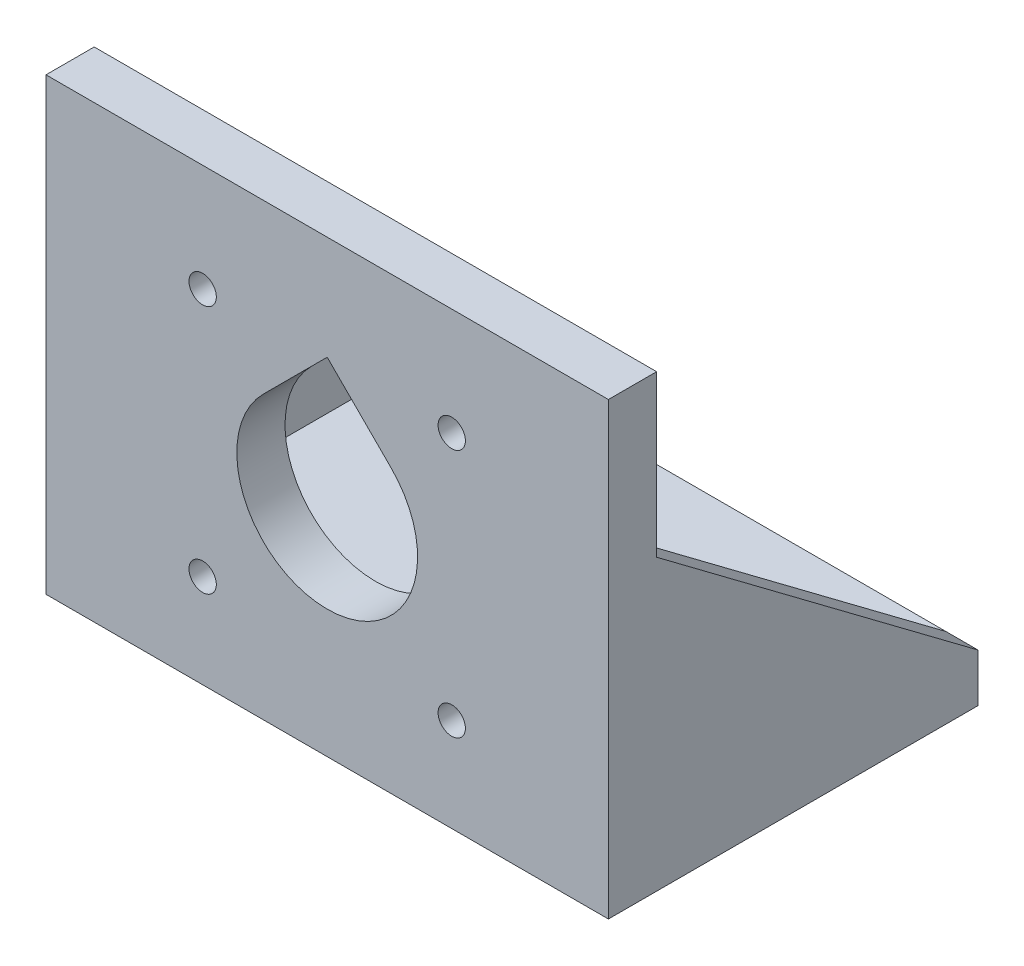
ISO-10303-21;
HEADER;
FILE_DESCRIPTION(('STEP AP214'),'2;1');
FILE_NAME('part.step','',(''),(''),'','','');
FILE_SCHEMA(('AUTOMOTIVE_DESIGN { 1 0 10303 214 1 1 1 1 }'));
ENDSEC;
DATA;
#1=APPLICATION_CONTEXT('core data for automotive mechanical design processes');
#2=APPLICATION_PROTOCOL_DEFINITION('international standard','automotive_design',2000,#1);
#3=PRODUCT_CONTEXT('',#1,'mechanical');
#4=PRODUCT('Part','Part','',(#3));
#5=PRODUCT_RELATED_PRODUCT_CATEGORY('part','',(#4));
#6=PRODUCT_DEFINITION_FORMATION('','',#4);
#7=PRODUCT_DEFINITION_CONTEXT('part definition',#1,'design');
#8=PRODUCT_DEFINITION('design','',#6,#7);
#9=PRODUCT_DEFINITION_SHAPE('','',#8);
#10=(LENGTH_UNIT() NAMED_UNIT(*) SI_UNIT(.MILLI.,.METRE.));
#11=(NAMED_UNIT(*) PLANE_ANGLE_UNIT() SI_UNIT($,.RADIAN.));
#12=(NAMED_UNIT(*) SI_UNIT($,.STERADIAN.) SOLID_ANGLE_UNIT());
#13=UNCERTAINTY_MEASURE_WITH_UNIT(LENGTH_MEASURE(1.E-05),#10,'distance_accuracy_value','');
#14=(GEOMETRIC_REPRESENTATION_CONTEXT(3) GLOBAL_UNCERTAINTY_ASSIGNED_CONTEXT((#13)) GLOBAL_UNIT_ASSIGNED_CONTEXT((#10,
#11,#12)) REPRESENTATION_CONTEXT('',''));
#15=CARTESIAN_POINT('',(0.,0.,0.));
#16=DIRECTION('',(0.,0.,1.));
#17=DIRECTION('',(1.,0.,0.));
#18=AXIS2_PLACEMENT_3D('',#15,#16,#17);
#19=CARTESIAN_POINT('',(0.,0.,0.));
#20=DIRECTION('',(0.,0.,-1.));
#21=DIRECTION('',(-1.,0.,0.));
#22=AXIS2_PLACEMENT_3D('',#19,#20,#21);
#23=PLANE('',#22);
#24=DIRECTION('',(0.707106781186548,0.707106781186548,0.));
#25=VECTOR('',#24,1.);
#26=CARTESIAN_POINT('',(-4.02995128834866,4.02995128834866,0.));
#27=LINE('',#26,#25);
#28=CARTESIAN_POINT('',(27.0450487116513,35.1049512883487,0.));
#29=VERTEX_POINT('',#28);
#30=CARTESIAN_POINT('',(35.,43.0599025766973,0.));
#31=VERTEX_POINT('',#30);
#32=EDGE_CURVE('E268',#29,#31,#27,.T.);
#33=ORIENTED_EDGE('',*,*,#32,.F.);
#34=CARTESIAN_POINT('',(35.,27.15,0.));
#35=DIRECTION('',(0.,0.,-1.));
#36=DIRECTION('',(-1.,0.,0.));
#37=AXIS2_PLACEMENT_3D('',#34,#35,#36);
#38=CIRCLE('',#37,11.25);
#39=CARTESIAN_POINT('',(42.9549512883487,35.1049512883487,0.));
#40=VERTEX_POINT('',#39);
#41=EDGE_CURVE('E149',#40,#29,#38,.T.);
#42=ORIENTED_EDGE('',*,*,#41,.F.);
#43=DIRECTION('',(0.707106781186548,-0.707106781186548,0.));
#44=VECTOR('',#43,1.);
#45=CARTESIAN_POINT('',(39.0299512883487,39.0299512883487,0.));
#46=LINE('',#45,#44);
#47=EDGE_CURVE('E136',#31,#40,#46,.T.);
#48=ORIENTED_EDGE('',*,*,#47,.F.);
#49=EDGE_LOOP('',(#33,#42,#48));
#50=FACE_BOUND('',#49,.T.);
#51=CARTESIAN_POINT('',(50.5,42.65,0.));
#52=DIRECTION('',(0.,0.,-1.));
#53=DIRECTION('',(-1.,0.,0.));
#54=AXIS2_PLACEMENT_3D('',#51,#52,#53);
#55=CIRCLE('',#54,1.7);
#56=CARTESIAN_POINT('',(48.8,42.65,0.));
#57=VERTEX_POINT('',#56);
#58=EDGE_CURVE('E169',#57,#57,#55,.T.);
#59=ORIENTED_EDGE('',*,*,#58,.F.);
#60=EDGE_LOOP('',(#59));
#61=FACE_BOUND('',#60,.T.);
#62=CARTESIAN_POINT('',(50.5,11.65,0.));
#63=DIRECTION('',(0.,0.,-1.));
#64=DIRECTION('',(-1.,0.,0.));
#65=AXIS2_PLACEMENT_3D('',#62,#63,#64);
#66=CIRCLE('',#65,1.7);
#67=CARTESIAN_POINT('',(48.8,11.65,0.));
#68=VERTEX_POINT('',#67);
#69=EDGE_CURVE('E166',#68,#68,#66,.T.);
#70=ORIENTED_EDGE('',*,*,#69,.F.);
#71=EDGE_LOOP('',(#70));
#72=FACE_BOUND('',#71,.T.);
#73=CARTESIAN_POINT('',(19.5,42.65,0.));
#74=DIRECTION('',(0.,0.,-1.));
#75=DIRECTION('',(-1.,0.,0.));
#76=AXIS2_PLACEMENT_3D('',#73,#74,#75);
#77=CIRCLE('',#76,1.7);
#78=CARTESIAN_POINT('',(17.8,42.65,0.));
#79=VERTEX_POINT('',#78);
#80=EDGE_CURVE('E163',#79,#79,#77,.T.);
#81=ORIENTED_EDGE('',*,*,#80,.F.);
#82=EDGE_LOOP('',(#81));
#83=FACE_BOUND('',#82,.T.);
#84=CARTESIAN_POINT('',(19.5,11.65,0.));
#85=DIRECTION('',(0.,0.,-1.));
#86=DIRECTION('',(-1.,0.,0.));
#87=AXIS2_PLACEMENT_3D('',#84,#85,#86);
#88=CIRCLE('',#87,1.7);
#89=CARTESIAN_POINT('',(17.8,11.65,0.));
#90=VERTEX_POINT('',#89);
#91=EDGE_CURVE('E152',#90,#90,#88,.T.);
#92=ORIENTED_EDGE('',*,*,#91,.F.);
#93=EDGE_LOOP('',(#92));
#94=FACE_BOUND('',#93,.T.);
#95=DIRECTION('',(0.,1.,0.));
#96=VECTOR('',#95,1.);
#97=CARTESIAN_POINT('',(70.,0.,0.));
#98=LINE('',#97,#96);
#99=CARTESIAN_POINT('',(70.,36.,0.));
#100=VERTEX_POINT('',#99);
#101=CARTESIAN_POINT('',(70.,56.,0.));
#102=VERTEX_POINT('',#101);
#103=EDGE_CURVE('E226',#100,#102,#98,.T.);
#104=ORIENTED_EDGE('',*,*,#103,.F.);
#105=DIRECTION('',(-1.,0.,0.));
#106=VECTOR('',#105,1.);
#107=CARTESIAN_POINT('',(70.,36.,0.));
#108=LINE('',#107,#106);
#109=CARTESIAN_POINT('',(66.,36.,0.));
#110=VERTEX_POINT('',#109);
#111=EDGE_CURVE('E174',#100,#110,#108,.T.);
#112=ORIENTED_EDGE('',*,*,#111,.T.);
#113=DIRECTION('',(0.,-1.,0.));
#114=VECTOR('',#113,1.);
#115=CARTESIAN_POINT('',(66.,5.99999999999999,0.));
#116=LINE('',#115,#114);
#117=CARTESIAN_POINT('',(66.,5.99999999999999,0.));
#118=VERTEX_POINT('',#117);
#119=EDGE_CURVE('E177',#110,#118,#116,.T.);
#120=ORIENTED_EDGE('',*,*,#119,.T.);
#121=DIRECTION('',(1.,0.,0.));
#122=VECTOR('',#121,1.);
#123=CARTESIAN_POINT('',(0.,6.,0.));
#124=LINE('',#123,#122);
#125=CARTESIAN_POINT('',(4.,6.,0.));
#126=VERTEX_POINT('',#125);
#127=EDGE_CURVE('E238',#126,#118,#124,.T.);
#128=ORIENTED_EDGE('',*,*,#127,.F.);
#129=DIRECTION('',(0.,-1.,0.));
#130=VECTOR('',#129,1.);
#131=CARTESIAN_POINT('',(4.,5.99999999999999,0.));
#132=LINE('',#131,#130);
#133=CARTESIAN_POINT('',(4.,36.,0.));
#134=VERTEX_POINT('',#133);
#135=EDGE_CURVE('E188',#134,#126,#132,.T.);
#136=ORIENTED_EDGE('',*,*,#135,.F.);
#137=DIRECTION('',(-1.,0.,0.));
#138=VECTOR('',#137,1.);
#139=CARTESIAN_POINT('',(4.,36.,0.));
#140=LINE('',#139,#138);
#141=CARTESIAN_POINT('',(0.,36.,0.));
#142=VERTEX_POINT('',#141);
#143=EDGE_CURVE('E199',#134,#142,#140,.T.);
#144=ORIENTED_EDGE('',*,*,#143,.T.);
#145=DIRECTION('',(0.,-1.,0.));
#146=VECTOR('',#145,1.);
#147=CARTESIAN_POINT('',(0.,0.,0.));
#148=LINE('',#147,#146);
#149=CARTESIAN_POINT('',(0.,56.,0.));
#150=VERTEX_POINT('',#149);
#151=EDGE_CURVE('E213',#150,#142,#148,.T.);
#152=ORIENTED_EDGE('',*,*,#151,.F.);
#153=DIRECTION('',(-1.,0.,0.));
#154=VECTOR('',#153,1.);
#155=CARTESIAN_POINT('',(0.,56.,0.));
#156=LINE('',#155,#154);
#157=EDGE_CURVE('E217',#102,#150,#156,.T.);
#158=ORIENTED_EDGE('',*,*,#157,.F.);
#159=EDGE_LOOP('',(#104,#112,#120,#128,#136,#144,#152,#158));
#160=FACE_BOUND('',#159,.T.);
#161=ADVANCED_FACE('F41',(#50,#61,#72,#83,#94,#160),#23,.T.);
#162=CARTESIAN_POINT('',(0.,6.,0.));
#163=DIRECTION('',(0.,1.,0.));
#164=DIRECTION('',(0.,0.,1.));
#165=AXIS2_PLACEMENT_3D('',#162,#163,#164);
#166=PLANE('',#165);
#167=CARTESIAN_POINT('',(8.5,6.,-30.));
#168=DIRECTION('',(0.,1.,0.));
#169=DIRECTION('',(0.,0.,1.));
#170=AXIS2_PLACEMENT_3D('',#167,#168,#169);
#171=CIRCLE('',#170,2.25);
#172=CARTESIAN_POINT('',(8.5,6.,-27.75));
#173=VERTEX_POINT('',#172);
#174=EDGE_CURVE('E262',#173,#173,#171,.T.);
#175=ORIENTED_EDGE('',*,*,#174,.F.);
#176=EDGE_LOOP('',(#175));
#177=FACE_BOUND('',#176,.T.);
#178=CARTESIAN_POINT('',(61.5,6.,-12.));
#179=DIRECTION('',(0.,1.,0.));
#180=DIRECTION('',(0.,0.,1.));
#181=AXIS2_PLACEMENT_3D('',#178,#179,#180);
#182=CIRCLE('',#181,2.25);
#183=CARTESIAN_POINT('',(61.5,6.,-9.75000000000001));
#184=VERTEX_POINT('',#183);
#185=EDGE_CURVE('E251',#184,#184,#182,.T.);
#186=ORIENTED_EDGE('',*,*,#185,.F.);
#187=EDGE_LOOP('',(#186));
#188=FACE_BOUND('',#187,.T.);
#189=CARTESIAN_POINT('',(61.5,6.,-30.));
#190=DIRECTION('',(0.,1.,0.));
#191=DIRECTION('',(0.,0.,1.));
#192=AXIS2_PLACEMENT_3D('',#189,#190,#191);
#193=CIRCLE('',#192,2.25);
#194=CARTESIAN_POINT('',(61.5,6.,-27.75));
#195=VERTEX_POINT('',#194);
#196=EDGE_CURVE('E248',#195,#195,#193,.T.);
#197=ORIENTED_EDGE('',*,*,#196,.F.);
#198=EDGE_LOOP('',(#197));
#199=FACE_BOUND('',#198,.T.);
#200=CARTESIAN_POINT('',(8.5,6.,-12.));
#201=DIRECTION('',(0.,1.,0.));
#202=DIRECTION('',(0.,0.,1.));
#203=AXIS2_PLACEMENT_3D('',#200,#201,#202);
#204=CIRCLE('',#203,2.25);
#205=CARTESIAN_POINT('',(8.5,6.,-9.75));
#206=VERTEX_POINT('',#205);
#207=EDGE_CURVE('E245',#206,#206,#204,.T.);
#208=ORIENTED_EDGE('',*,*,#207,.F.);
#209=EDGE_LOOP('',(#208));
#210=FACE_BOUND('',#209,.T.);
#211=ORIENTED_EDGE('',*,*,#127,.T.);
#212=DIRECTION('',(0.,0.,-1.));
#213=VECTOR('',#212,1.);
#214=CARTESIAN_POINT('',(66.,6.,-40.));
#215=LINE('',#214,#213);
#216=CARTESIAN_POINT('',(66.,6.,-40.));
#217=VERTEX_POINT('',#216);
#218=EDGE_CURVE('E175',#118,#217,#215,.T.);
#219=ORIENTED_EDGE('',*,*,#218,.T.);
#220=DIRECTION('',(-1.,0.,0.));
#221=VECTOR('',#220,1.);
#222=CARTESIAN_POINT('',(0.,6.,-40.));
#223=LINE('',#222,#221);
#224=CARTESIAN_POINT('',(4.,6.,-40.));
#225=VERTEX_POINT('',#224);
#226=EDGE_CURVE('E205',#217,#225,#223,.T.);
#227=ORIENTED_EDGE('',*,*,#226,.T.);
#228=DIRECTION('',(0.,0.,-1.));
#229=VECTOR('',#228,1.);
#230=CARTESIAN_POINT('',(4.,6.,-40.));
#231=LINE('',#230,#229);
#232=EDGE_CURVE('E191',#126,#225,#231,.T.);
#233=ORIENTED_EDGE('',*,*,#232,.F.);
#234=EDGE_LOOP('',(#211,#219,#227,#233));
#235=FACE_BOUND('',#234,.T.);
#236=ADVANCED_FACE('F307',(#177,#188,#199,#210,#235),#166,.T.);
#237=CARTESIAN_POINT('',(0.,0.,6.));
#238=DIRECTION('',(1.,0.,0.));
#239=DIRECTION('',(0.,0.,-1.));
#240=AXIS2_PLACEMENT_3D('',#237,#238,#239);
#241=PLANE('',#240);
#242=ORIENTED_EDGE('',*,*,#151,.T.);
#243=DIRECTION('',(0.,0.6,0.8));
#244=VECTOR('',#243,1.);
#245=CARTESIAN_POINT('',(0.,36.,0.));
#246=LINE('',#245,#244);
#247=CARTESIAN_POINT('',(0.,6.,-40.));
#248=VERTEX_POINT('',#247);
#249=EDGE_CURVE('E184',#248,#142,#246,.T.);
#250=ORIENTED_EDGE('',*,*,#249,.F.);
#251=DIRECTION('',(0.,-1.,0.));
#252=VECTOR('',#251,1.);
#253=CARTESIAN_POINT('',(0.,6.,-40.));
#254=LINE('',#253,#252);
#255=CARTESIAN_POINT('',(0.,0.,-40.));
#256=VERTEX_POINT('',#255);
#257=EDGE_CURVE('E204',#248,#256,#254,.T.);
#258=ORIENTED_EDGE('',*,*,#257,.T.);
#259=DIRECTION('',(0.,0.,-1.));
#260=VECTOR('',#259,1.);
#261=CARTESIAN_POINT('',(0.,0.,6.));
#262=LINE('',#261,#260);
#263=CARTESIAN_POINT('',(0.,0.,6.));
#264=VERTEX_POINT('',#263);
#265=EDGE_CURVE('E236',#264,#256,#262,.T.);
#266=ORIENTED_EDGE('',*,*,#265,.F.);
#267=DIRECTION('',(0.,-1.,0.));
#268=VECTOR('',#267,1.);
#269=CARTESIAN_POINT('',(0.,0.,6.));
#270=LINE('',#269,#268);
#271=CARTESIAN_POINT('',(0.,56.,6.));
#272=VERTEX_POINT('',#271);
#273=EDGE_CURVE('E214',#272,#264,#270,.T.);
#274=ORIENTED_EDGE('',*,*,#273,.F.);
#275=DIRECTION('',(0.,0.,-1.));
#276=VECTOR('',#275,1.);
#277=CARTESIAN_POINT('',(0.,56.,6.));
#278=LINE('',#277,#276);
#279=EDGE_CURVE('E223',#272,#150,#278,.T.);
#280=ORIENTED_EDGE('',*,*,#279,.T.);
#281=EDGE_LOOP('',(#242,#250,#258,#266,#274,#280));
#282=FACE_BOUND('',#281,.T.);
#283=ADVANCED_FACE('F43',(#282),#241,.F.);
#284=CARTESIAN_POINT('',(0.,0.,6.));
#285=DIRECTION('',(0.,1.,0.));
#286=DIRECTION('',(0.,0.,1.));
#287=AXIS2_PLACEMENT_3D('',#284,#285,#286);
#288=PLANE('',#287);
#289=CARTESIAN_POINT('',(8.5,0.,-30.));
#290=DIRECTION('',(0.,1.,0.));
#291=DIRECTION('',(0.,0.,1.));
#292=AXIS2_PLACEMENT_3D('',#289,#290,#291);
#293=CIRCLE('',#292,2.25);
#294=CARTESIAN_POINT('',(8.5,0.,-27.75));
#295=VERTEX_POINT('',#294);
#296=EDGE_CURVE('E45',#295,#295,#293,.T.);
#297=ORIENTED_EDGE('',*,*,#296,.T.);
#298=EDGE_LOOP('',(#297));
#299=FACE_BOUND('',#298,.T.);
#300=CARTESIAN_POINT('',(61.5,0.,-12.));
#301=DIRECTION('',(0.,1.,0.));
#302=DIRECTION('',(0.,0.,1.));
#303=AXIS2_PLACEMENT_3D('',#300,#301,#302);
#304=CIRCLE('',#303,2.25);
#305=CARTESIAN_POINT('',(61.5,0.,-9.75000000000001));
#306=VERTEX_POINT('',#305);
#307=EDGE_CURVE('E249',#306,#306,#304,.T.);
#308=ORIENTED_EDGE('',*,*,#307,.T.);
#309=EDGE_LOOP('',(#308));
#310=FACE_BOUND('',#309,.T.);
#311=CARTESIAN_POINT('',(61.5,0.,-30.));
#312=DIRECTION('',(0.,1.,0.));
#313=DIRECTION('',(0.,0.,1.));
#314=AXIS2_PLACEMENT_3D('',#311,#312,#313);
#315=CIRCLE('',#314,2.25);
#316=CARTESIAN_POINT('',(61.5,0.,-27.75));
#317=VERTEX_POINT('',#316);
#318=EDGE_CURVE('E246',#317,#317,#315,.T.);
#319=ORIENTED_EDGE('',*,*,#318,.T.);
#320=EDGE_LOOP('',(#319));
#321=FACE_BOUND('',#320,.T.);
#322=CARTESIAN_POINT('',(8.5,0.,-12.));
#323=DIRECTION('',(0.,1.,0.));
#324=DIRECTION('',(0.,0.,1.));
#325=AXIS2_PLACEMENT_3D('',#322,#323,#324);
#326=CIRCLE('',#325,2.25);
#327=CARTESIAN_POINT('',(8.5,0.,-9.75));
#328=VERTEX_POINT('',#327);
#329=EDGE_CURVE('E242',#328,#328,#326,.T.);
#330=ORIENTED_EDGE('',*,*,#329,.T.);
#331=EDGE_LOOP('',(#330));
#332=FACE_BOUND('',#331,.T.);
#333=ORIENTED_EDGE('',*,*,#265,.T.);
#334=DIRECTION('',(-1.,0.,0.));
#335=VECTOR('',#334,1.);
#336=CARTESIAN_POINT('',(0.,0.,-40.));
#337=LINE('',#336,#335);
#338=CARTESIAN_POINT('',(70.,0.,-40.));
#339=VERTEX_POINT('',#338);
#340=EDGE_CURVE('E201',#339,#256,#337,.T.);
#341=ORIENTED_EDGE('',*,*,#340,.F.);
#342=DIRECTION('',(0.,0.,-1.));
#343=VECTOR('',#342,1.);
#344=CARTESIAN_POINT('',(70.,0.,6.));
#345=LINE('',#344,#343);
#346=CARTESIAN_POINT('',(70.,0.,6.));
#347=VERTEX_POINT('',#346);
#348=EDGE_CURVE('E234',#347,#339,#345,.T.);
#349=ORIENTED_EDGE('',*,*,#348,.F.);
#350=DIRECTION('',(1.,0.,0.));
#351=VECTOR('',#350,1.);
#352=CARTESIAN_POINT('',(0.,0.,6.));
#353=LINE('',#352,#351);
#354=EDGE_CURVE('E216',#264,#347,#353,.T.);
#355=ORIENTED_EDGE('',*,*,#354,.F.);
#356=EDGE_LOOP('',(#333,#341,#349,#355));
#357=FACE_BOUND('',#356,.T.);
#358=ADVANCED_FACE('F325',(#299,#310,#321,#332,#357),#288,.F.);
#359=CARTESIAN_POINT('',(70.,0.,6.));
#360=DIRECTION('',(-1.,0.,0.));
#361=DIRECTION('',(0.,0.,1.));
#362=AXIS2_PLACEMENT_3D('',#359,#360,#361);
#363=PLANE('',#362);
#364=DIRECTION('',(0.,0.6,0.8));
#365=VECTOR('',#364,1.);
#366=CARTESIAN_POINT('',(70.,36.,0.));
#367=LINE('',#366,#365);
#368=CARTESIAN_POINT('',(70.,6.,-40.));
#369=VERTEX_POINT('',#368);
#370=EDGE_CURVE('E172',#369,#100,#367,.T.);
#371=ORIENTED_EDGE('',*,*,#370,.T.);
#372=ORIENTED_EDGE('',*,*,#103,.T.);
#373=DIRECTION('',(0.,0.,-1.));
#374=VECTOR('',#373,1.);
#375=CARTESIAN_POINT('',(70.,56.,6.));
#376=LINE('',#375,#374);
#377=CARTESIAN_POINT('',(70.,56.,6.));
#378=VERTEX_POINT('',#377);
#379=EDGE_CURVE('E231',#378,#102,#376,.T.);
#380=ORIENTED_EDGE('',*,*,#379,.F.);
#381=DIRECTION('',(0.,1.,0.));
#382=VECTOR('',#381,1.);
#383=CARTESIAN_POINT('',(70.,0.,6.));
#384=LINE('',#383,#382);
#385=EDGE_CURVE('E219',#347,#378,#384,.T.);
#386=ORIENTED_EDGE('',*,*,#385,.F.);
#387=ORIENTED_EDGE('',*,*,#348,.T.);
#388=DIRECTION('',(0.,-1.,0.));
#389=VECTOR('',#388,1.);
#390=CARTESIAN_POINT('',(70.,6.,-40.));
#391=LINE('',#390,#389);
#392=EDGE_CURVE('E210',#369,#339,#391,.T.);
#393=ORIENTED_EDGE('',*,*,#392,.F.);
#394=EDGE_LOOP('',(#371,#372,#380,#386,#387,#393));
#395=FACE_BOUND('',#394,.T.);
#396=ADVANCED_FACE('F322',(#395),#363,.F.);
#397=CARTESIAN_POINT('',(0.,56.,6.));
#398=DIRECTION('',(0.,-1.,0.));
#399=DIRECTION('',(0.,0.,-1.));
#400=AXIS2_PLACEMENT_3D('',#397,#398,#399);
#401=PLANE('',#400);
#402=ORIENTED_EDGE('',*,*,#157,.T.);
#403=ORIENTED_EDGE('',*,*,#279,.F.);
#404=DIRECTION('',(-1.,0.,0.));
#405=VECTOR('',#404,1.);
#406=CARTESIAN_POINT('',(0.,56.,6.));
#407=LINE('',#406,#405);
#408=EDGE_CURVE('E221',#378,#272,#407,.T.);
#409=ORIENTED_EDGE('',*,*,#408,.F.);
#410=ORIENTED_EDGE('',*,*,#379,.T.);
#411=EDGE_LOOP('',(#402,#403,#409,#410));
#412=FACE_BOUND('',#411,.T.);
#413=ADVANCED_FACE('F283',(#412),#401,.F.);
#414=CARTESIAN_POINT('',(0.,0.,6.));
#415=DIRECTION('',(0.,0.,-1.));
#416=DIRECTION('',(-1.,0.,0.));
#417=AXIS2_PLACEMENT_3D('',#414,#415,#416);
#418=PLANE('',#417);
#419=CARTESIAN_POINT('',(50.5,42.65,6.));
#420=DIRECTION('',(0.,0.,1.));
#421=DIRECTION('',(1.,0.,0.));
#422=AXIS2_PLACEMENT_3D('',#419,#420,#421);
#423=CIRCLE('',#422,1.7);
#424=CARTESIAN_POINT('',(52.2,42.65,6.));
#425=VERTEX_POINT('',#424);
#426=EDGE_CURVE('E158',#425,#425,#423,.T.);
#427=ORIENTED_EDGE('',*,*,#426,.F.);
#428=EDGE_LOOP('',(#427));
#429=FACE_BOUND('',#428,.T.);
#430=CARTESIAN_POINT('',(50.5,11.65,6.));
#431=DIRECTION('',(0.,0.,1.));
#432=DIRECTION('',(1.,0.,0.));
#433=AXIS2_PLACEMENT_3D('',#430,#431,#432);
#434=CIRCLE('',#433,1.7);
#435=CARTESIAN_POINT('',(52.2,11.65,6.));
#436=VERTEX_POINT('',#435);
#437=EDGE_CURVE('E271',#436,#436,#434,.T.);
#438=ORIENTED_EDGE('',*,*,#437,.F.);
#439=EDGE_LOOP('',(#438));
#440=FACE_BOUND('',#439,.T.);
#441=CARTESIAN_POINT('',(19.5,42.65,6.));
#442=DIRECTION('',(0.,0.,1.));
#443=DIRECTION('',(1.,0.,0.));
#444=AXIS2_PLACEMENT_3D('',#441,#442,#443);
#445=CIRCLE('',#444,1.7);
#446=CARTESIAN_POINT('',(21.2,42.65,6.));
#447=VERTEX_POINT('',#446);
#448=EDGE_CURVE('E155',#447,#447,#445,.T.);
#449=ORIENTED_EDGE('',*,*,#448,.F.);
#450=EDGE_LOOP('',(#449));
#451=FACE_BOUND('',#450,.T.);
#452=CARTESIAN_POINT('',(19.5,11.65,6.));
#453=DIRECTION('',(0.,0.,1.));
#454=DIRECTION('',(1.,0.,0.));
#455=AXIS2_PLACEMENT_3D('',#452,#453,#454);
#456=CIRCLE('',#455,1.7);
#457=CARTESIAN_POINT('',(21.2,11.65,6.));
#458=VERTEX_POINT('',#457);
#459=EDGE_CURVE('E150',#458,#458,#456,.T.);
#460=ORIENTED_EDGE('',*,*,#459,.F.);
#461=EDGE_LOOP('',(#460));
#462=FACE_BOUND('',#461,.T.);
#463=CARTESIAN_POINT('',(35.,27.15,6.));
#464=DIRECTION('',(0.,0.,1.));
#465=DIRECTION('',(1.,0.,0.));
#466=AXIS2_PLACEMENT_3D('',#463,#464,#465);
#467=CIRCLE('',#466,11.25);
#468=CARTESIAN_POINT('',(27.0450487116513,35.1049512883487,6.));
#469=VERTEX_POINT('',#468);
#470=CARTESIAN_POINT('',(42.9549512883487,35.1049512883487,6.));
#471=VERTEX_POINT('',#470);
#472=EDGE_CURVE('E145',#469,#471,#467,.T.);
#473=ORIENTED_EDGE('',*,*,#472,.F.);
#474=DIRECTION('',(-0.707106781186547,-0.707106781186547,0.));
#475=VECTOR('',#474,1.);
#476=CARTESIAN_POINT('',(35.,43.0599025766973,6.));
#477=LINE('',#476,#475);
#478=CARTESIAN_POINT('',(35.,43.0599025766973,6.));
#479=VERTEX_POINT('',#478);
#480=EDGE_CURVE('E58',#479,#469,#477,.T.);
#481=ORIENTED_EDGE('',*,*,#480,.F.);
#482=DIRECTION('',(-0.707106781186547,0.707106781186547,0.));
#483=VECTOR('',#482,1.);
#484=CARTESIAN_POINT('',(42.9549512883487,35.1049512883487,6.));
#485=LINE('',#484,#483);
#486=EDGE_CURVE('E134',#471,#479,#485,.T.);
#487=ORIENTED_EDGE('',*,*,#486,.F.);
#488=EDGE_LOOP('',(#473,#481,#487));
#489=FACE_BOUND('',#488,.T.);
#490=ORIENTED_EDGE('',*,*,#273,.T.);
#491=ORIENTED_EDGE('',*,*,#354,.T.);
#492=ORIENTED_EDGE('',*,*,#385,.T.);
#493=ORIENTED_EDGE('',*,*,#408,.T.);
#494=EDGE_LOOP('',(#490,#491,#492,#493));
#495=FACE_BOUND('',#494,.T.);
#496=ADVANCED_FACE('F143',(#429,#440,#451,#462,#489,#495),#418,.F.);
#497=CARTESIAN_POINT('',(0.,6.,-40.));
#498=DIRECTION('',(0.,0.,1.));
#499=DIRECTION('',(1.,0.,0.));
#500=AXIS2_PLACEMENT_3D('',#497,#498,#499);
#501=PLANE('',#500);
#502=ORIENTED_EDGE('',*,*,#340,.T.);
#503=ORIENTED_EDGE('',*,*,#257,.F.);
#504=DIRECTION('',(-1.,0.,0.));
#505=VECTOR('',#504,1.);
#506=CARTESIAN_POINT('',(4.,6.,-40.));
#507=LINE('',#506,#505);
#508=EDGE_CURVE('E194',#225,#248,#507,.T.);
#509=ORIENTED_EDGE('',*,*,#508,.F.);
#510=ORIENTED_EDGE('',*,*,#226,.F.);
#511=EDGE_CURVE('E202',#369,#217,#223,.T.);
#512=ORIENTED_EDGE('',*,*,#511,.F.);
#513=ORIENTED_EDGE('',*,*,#392,.T.);
#514=EDGE_LOOP('',(#502,#503,#509,#510,#512,#513));
#515=FACE_BOUND('',#514,.T.);
#516=ADVANCED_FACE('F282',(#515),#501,.F.);
#517=CARTESIAN_POINT('',(4.,36.,0.));
#518=DIRECTION('',(0.,-0.8,0.6));
#519=DIRECTION('',(0.,-0.6,-0.8));
#520=AXIS2_PLACEMENT_3D('',#517,#518,#519);
#521=PLANE('',#520);
#522=ORIENTED_EDGE('',*,*,#249,.T.);
#523=ORIENTED_EDGE('',*,*,#143,.F.);
#524=DIRECTION('',(0.,0.6,0.8));
#525=VECTOR('',#524,1.);
#526=CARTESIAN_POINT('',(4.,36.,0.));
#527=LINE('',#526,#525);
#528=EDGE_CURVE('E185',#225,#134,#527,.T.);
#529=ORIENTED_EDGE('',*,*,#528,.F.);
#530=ORIENTED_EDGE('',*,*,#508,.T.);
#531=EDGE_LOOP('',(#522,#523,#529,#530));
#532=FACE_BOUND('',#531,.T.);
#533=ADVANCED_FACE('F354',(#532),#521,.F.);
#534=CARTESIAN_POINT('',(4.,0.,0.));
#535=DIRECTION('',(1.,0.,0.));
#536=DIRECTION('',(0.,0.,-1.));
#537=AXIS2_PLACEMENT_3D('',#534,#535,#536);
#538=PLANE('',#537);
#539=ORIENTED_EDGE('',*,*,#528,.T.);
#540=ORIENTED_EDGE('',*,*,#135,.T.);
#541=ORIENTED_EDGE('',*,*,#232,.T.);
#542=EDGE_LOOP('',(#539,#540,#541));
#543=FACE_BOUND('',#542,.T.);
#544=ADVANCED_FACE('F358',(#543),#538,.T.);
#545=CARTESIAN_POINT('',(70.,36.,0.));
#546=DIRECTION('',(0.,-0.8,0.6));
#547=DIRECTION('',(0.,-0.6,-0.8));
#548=AXIS2_PLACEMENT_3D('',#545,#546,#547);
#549=PLANE('',#548);
#550=DIRECTION('',(0.,0.6,0.8));
#551=VECTOR('',#550,1.);
#552=CARTESIAN_POINT('',(66.,36.,0.));
#553=LINE('',#552,#551);
#554=EDGE_CURVE('E66',#217,#110,#553,.T.);
#555=ORIENTED_EDGE('',*,*,#554,.T.);
#556=ORIENTED_EDGE('',*,*,#111,.F.);
#557=ORIENTED_EDGE('',*,*,#370,.F.);
#558=ORIENTED_EDGE('',*,*,#511,.T.);
#559=EDGE_LOOP('',(#555,#556,#557,#558));
#560=FACE_BOUND('',#559,.T.);
#561=ADVANCED_FACE('F365',(#560),#549,.F.);
#562=CARTESIAN_POINT('',(66.,0.,0.));
#563=DIRECTION('',(1.,0.,0.));
#564=DIRECTION('',(0.,0.,-1.));
#565=AXIS2_PLACEMENT_3D('',#562,#563,#564);
#566=PLANE('',#565);
#567=ORIENTED_EDGE('',*,*,#554,.F.);
#568=ORIENTED_EDGE('',*,*,#218,.F.);
#569=ORIENTED_EDGE('',*,*,#119,.F.);
#570=EDGE_LOOP('',(#567,#568,#569));
#571=FACE_BOUND('',#570,.T.);
#572=ADVANCED_FACE('F303',(#571),#566,.F.);
#573=CARTESIAN_POINT('',(35.,27.15,-40.));
#574=DIRECTION('',(0.,0.,1.));
#575=DIRECTION('',(1.,0.,0.));
#576=AXIS2_PLACEMENT_3D('',#573,#574,#575);
#577=CYLINDRICAL_SURFACE('',#576,11.25);
#578=ORIENTED_EDGE('',*,*,#472,.T.);
#579=DIRECTION('',(0.,0.,1.));
#580=VECTOR('',#579,1.);
#581=CARTESIAN_POINT('',(42.9549512883487,35.1049512883487,-40.));
#582=LINE('',#581,#580);
#583=EDGE_CURVE('E11',#471,#40,#582,.F.);
#584=ORIENTED_EDGE('',*,*,#583,.T.);
#585=ORIENTED_EDGE('',*,*,#41,.T.);
#586=DIRECTION('',(0.,0.,1.));
#587=VECTOR('',#586,1.);
#588=CARTESIAN_POINT('',(27.0450487116513,35.1049512883487,-40.));
#589=LINE('',#588,#587);
#590=EDGE_CURVE('E50',#29,#469,#589,.T.);
#591=ORIENTED_EDGE('',*,*,#590,.T.);
#592=EDGE_LOOP('',(#578,#584,#585,#591));
#593=FACE_BOUND('',#592,.T.);
#594=ADVANCED_FACE('F148',(#593),#577,.F.);
#595=CARTESIAN_POINT('',(19.5,11.65,-40.));
#596=DIRECTION('',(0.,0.,1.));
#597=DIRECTION('',(1.,0.,0.));
#598=AXIS2_PLACEMENT_3D('',#595,#596,#597);
#599=CYLINDRICAL_SURFACE('',#598,1.7);
#600=ORIENTED_EDGE('',*,*,#91,.T.);
#601=EDGE_LOOP('',(#600));
#602=FACE_BOUND('',#601,.T.);
#603=ORIENTED_EDGE('',*,*,#459,.T.);
#604=EDGE_LOOP('',(#603));
#605=FACE_BOUND('',#604,.T.);
#606=ADVANCED_FACE('F290',(#602,#605),#599,.F.);
#607=CARTESIAN_POINT('',(19.5,42.65,-40.));
#608=DIRECTION('',(0.,0.,1.));
#609=DIRECTION('',(1.,0.,0.));
#610=AXIS2_PLACEMENT_3D('',#607,#608,#609);
#611=CYLINDRICAL_SURFACE('',#610,1.7);
#612=ORIENTED_EDGE('',*,*,#80,.T.);
#613=EDGE_LOOP('',(#612));
#614=FACE_BOUND('',#613,.T.);
#615=ORIENTED_EDGE('',*,*,#448,.T.);
#616=EDGE_LOOP('',(#615));
#617=FACE_BOUND('',#616,.T.);
#618=ADVANCED_FACE('F292',(#614,#617),#611,.F.);
#619=CARTESIAN_POINT('',(50.5,11.65,-40.));
#620=DIRECTION('',(0.,0.,1.));
#621=DIRECTION('',(1.,0.,0.));
#622=AXIS2_PLACEMENT_3D('',#619,#620,#621);
#623=CYLINDRICAL_SURFACE('',#622,1.7);
#624=ORIENTED_EDGE('',*,*,#69,.T.);
#625=EDGE_LOOP('',(#624));
#626=FACE_BOUND('',#625,.T.);
#627=ORIENTED_EDGE('',*,*,#437,.T.);
#628=EDGE_LOOP('',(#627));
#629=FACE_BOUND('',#628,.T.);
#630=ADVANCED_FACE('F299',(#626,#629),#623,.F.);
#631=CARTESIAN_POINT('',(50.5,42.65,-40.));
#632=DIRECTION('',(0.,0.,1.));
#633=DIRECTION('',(1.,0.,0.));
#634=AXIS2_PLACEMENT_3D('',#631,#632,#633);
#635=CYLINDRICAL_SURFACE('',#634,1.7);
#636=ORIENTED_EDGE('',*,*,#58,.T.);
#637=EDGE_LOOP('',(#636));
#638=FACE_BOUND('',#637,.T.);
#639=ORIENTED_EDGE('',*,*,#426,.T.);
#640=EDGE_LOOP('',(#639));
#641=FACE_BOUND('',#640,.T.);
#642=ADVANCED_FACE('F278',(#638,#641),#635,.F.);
#643=CARTESIAN_POINT('',(35.,43.0599025766973,-40.));
#644=DIRECTION('',(-0.707106781186548,0.707106781186548,0.));
#645=DIRECTION('',(-0.707106781186548,-0.707106781186548,0.));
#646=AXIS2_PLACEMENT_3D('',#643,#644,#645);
#647=PLANE('',#646);
#648=ORIENTED_EDGE('',*,*,#32,.T.);
#649=DIRECTION('',(0.,0.,1.));
#650=VECTOR('',#649,1.);
#651=CARTESIAN_POINT('',(35.,43.0599025766973,-40.));
#652=LINE('',#651,#650);
#653=EDGE_CURVE('E146',#31,#479,#652,.T.);
#654=ORIENTED_EDGE('',*,*,#653,.T.);
#655=ORIENTED_EDGE('',*,*,#480,.T.);
#656=ORIENTED_EDGE('',*,*,#590,.F.);
#657=EDGE_LOOP('',(#648,#654,#655,#656));
#658=FACE_BOUND('',#657,.T.);
#659=ADVANCED_FACE('F447',(#658),#647,.F.);
#660=CARTESIAN_POINT('',(42.9549512883487,35.1049512883487,-40.));
#661=DIRECTION('',(0.707106781186548,0.707106781186548,0.));
#662=DIRECTION('',(-0.707106781186548,0.707106781186548,0.));
#663=AXIS2_PLACEMENT_3D('',#660,#661,#662);
#664=PLANE('',#663);
#665=ORIENTED_EDGE('',*,*,#47,.T.);
#666=ORIENTED_EDGE('',*,*,#583,.F.);
#667=ORIENTED_EDGE('',*,*,#486,.T.);
#668=ORIENTED_EDGE('',*,*,#653,.F.);
#669=EDGE_LOOP('',(#665,#666,#667,#668));
#670=FACE_BOUND('',#669,.T.);
#671=ADVANCED_FACE('F132',(#670),#664,.F.);
#672=CARTESIAN_POINT('',(8.5,-1.2E-05,-12.));
#673=DIRECTION('',(0.,1.,0.));
#674=DIRECTION('',(0.,0.,1.));
#675=AXIS2_PLACEMENT_3D('',#672,#673,#674);
#676=CYLINDRICAL_SURFACE('',#675,2.25);
#677=CARTESIAN_POINT('',(8.5,6.,-9.75));
#678=CARTESIAN_POINT('',(8.5,5.9375,-9.75));
#679=CARTESIAN_POINT('',(8.5,5.875,-9.75));
#680=CARTESIAN_POINT('',(8.5,5.75,-9.75));
#681=CARTESIAN_POINT('',(8.5,5.6875,-9.75));
#682=CARTESIAN_POINT('',(8.5,5.5625,-9.75));
#683=CARTESIAN_POINT('',(8.5,5.5,-9.75));
#684=CARTESIAN_POINT('',(8.5,5.375,-9.75));
#685=CARTESIAN_POINT('',(8.5,5.3125,-9.75));
#686=CARTESIAN_POINT('',(8.5,5.1875,-9.75));
#687=CARTESIAN_POINT('',(8.5,5.125,-9.75));
#688=CARTESIAN_POINT('',(8.5,5.,-9.75));
#689=CARTESIAN_POINT('',(8.5,4.9375,-9.75));
#690=CARTESIAN_POINT('',(8.5,4.8125,-9.75));
#691=CARTESIAN_POINT('',(8.5,4.75,-9.75));
#692=CARTESIAN_POINT('',(8.5,4.625,-9.75));
#693=CARTESIAN_POINT('',(8.5,4.5625,-9.75));
#694=CARTESIAN_POINT('',(8.5,4.4375,-9.75));
#695=CARTESIAN_POINT('',(8.5,4.375,-9.75));
#696=CARTESIAN_POINT('',(8.5,4.25,-9.75));
#697=CARTESIAN_POINT('',(8.5,4.1875,-9.75));
#698=CARTESIAN_POINT('',(8.5,4.0625,-9.75));
#699=CARTESIAN_POINT('',(8.5,4.,-9.75));
#700=CARTESIAN_POINT('',(8.5,3.875,-9.75));
#701=CARTESIAN_POINT('',(8.5,3.8125,-9.75));
#702=CARTESIAN_POINT('',(8.5,3.6875,-9.75));
#703=CARTESIAN_POINT('',(8.5,3.625,-9.75));
#704=CARTESIAN_POINT('',(8.5,3.5,-9.75));
#705=CARTESIAN_POINT('',(8.5,3.4375,-9.75));
#706=CARTESIAN_POINT('',(8.5,3.3125,-9.75));
#707=CARTESIAN_POINT('',(8.5,3.25,-9.75));
#708=CARTESIAN_POINT('',(8.5,3.125,-9.75));
#709=CARTESIAN_POINT('',(8.5,3.0625,-9.75));
#710=CARTESIAN_POINT('',(8.5,2.9375,-9.75));
#711=CARTESIAN_POINT('',(8.5,2.875,-9.75));
#712=CARTESIAN_POINT('',(8.5,2.75,-9.75));
#713=CARTESIAN_POINT('',(8.5,2.6875,-9.75));
#714=CARTESIAN_POINT('',(8.5,2.5625,-9.75));
#715=CARTESIAN_POINT('',(8.5,2.5,-9.75));
#716=CARTESIAN_POINT('',(8.5,2.375,-9.75));
#717=CARTESIAN_POINT('',(8.5,2.3125,-9.75));
#718=CARTESIAN_POINT('',(8.5,2.1875,-9.75));
#719=CARTESIAN_POINT('',(8.5,2.125,-9.75));
#720=CARTESIAN_POINT('',(8.5,2.,-9.75));
#721=CARTESIAN_POINT('',(8.5,1.9375,-9.75));
#722=CARTESIAN_POINT('',(8.5,1.8125,-9.75));
#723=CARTESIAN_POINT('',(8.5,1.75,-9.75));
#724=CARTESIAN_POINT('',(8.5,1.625,-9.75));
#725=CARTESIAN_POINT('',(8.5,1.5625,-9.75));
#726=CARTESIAN_POINT('',(8.5,1.4375,-9.75));
#727=CARTESIAN_POINT('',(8.5,1.375,-9.75));
#728=CARTESIAN_POINT('',(8.5,1.25,-9.75));
#729=CARTESIAN_POINT('',(8.5,1.1875,-9.75));
#730=CARTESIAN_POINT('',(8.5,1.0625,-9.75));
#731=CARTESIAN_POINT('',(8.5,1.,-9.75));
#732=CARTESIAN_POINT('',(8.5,0.875,-9.75));
#733=CARTESIAN_POINT('',(8.5,0.8125,-9.75));
#734=CARTESIAN_POINT('',(8.5,0.6875,-9.75));
#735=CARTESIAN_POINT('',(8.5,0.625,-9.75));
#736=CARTESIAN_POINT('',(8.5,0.5,-9.75));
#737=CARTESIAN_POINT('',(8.5,0.4375,-9.75));
#738=CARTESIAN_POINT('',(8.5,0.3125,-9.75));
#739=CARTESIAN_POINT('',(8.5,0.25,-9.75));
#740=CARTESIAN_POINT('',(8.5,0.125,-9.75));
#741=CARTESIAN_POINT('',(8.5,0.0624999999999999,-9.75));
#742=CARTESIAN_POINT('',(8.5,0.,-9.75));
#743=B_SPLINE_CURVE_WITH_KNOTS('',3,(#677,#678,#679,#680,#681,#682,#683,#684,#685,#686,#687,
#688,#689,#690,#691,#692,#693,#694,#695,#696,#697,#698,#699,#700,#701,#702,#703,#704,#705,#706,
#707,#708,#709,#710,#711,#712,#713,#714,#715,#716,#717,#718,#719,#720,#721,#722,#723,#724,#725,
#726,#727,#728,#729,#730,#731,#732,#733,#734,#735,#736,#737,#738,#739,#740,#741,#742),
.UNSPECIFIED.,.F.,.F.,(4,2,2,2,2,2,2,2,2,2,2,2,2,2,2,2,2,2,2,2,2,2,2,2,2,2,2,2,2,2,2,2,4),(0.,
0.1875,0.375,0.5625,0.75,0.9375,1.125,1.3125,1.5,1.6875,1.875,2.0625,2.25,2.4375,2.625,2.8125,
3.,3.1875,3.375,3.5625,3.75,3.9375,4.125,4.3125,4.5,4.6875,4.875,5.0625,5.25,5.4375,5.625,
5.8125,6.),.UNSPECIFIED.);
#744=EDGE_CURVE('BSEAM457',#206,#328,#743,.T.);
#745=ORIENTED_EDGE('',*,*,#207,.T.);
#746=ORIENTED_EDGE('',*,*,#329,.F.);
#747=ORIENTED_EDGE('',*,*,#744,.T.);
#748=ORIENTED_EDGE('',*,*,#744,.F.);
#749=EDGE_LOOP('',(#745,#747,#746,#748));
#750=FACE_BOUND('',#749,.T.);
#751=ADVANCED_FACE('F457',(#750),#676,.F.);
#752=CARTESIAN_POINT('',(61.5,-1.2E-05,-30.));
#753=DIRECTION('',(0.,1.,0.));
#754=DIRECTION('',(0.,0.,1.));
#755=AXIS2_PLACEMENT_3D('',#752,#753,#754);
#756=CYLINDRICAL_SURFACE('',#755,2.25);
#757=CARTESIAN_POINT('',(61.5,6.,-27.75));
#758=CARTESIAN_POINT('',(61.5,5.9375,-27.75));
#759=CARTESIAN_POINT('',(61.5,5.875,-27.75));
#760=CARTESIAN_POINT('',(61.5,5.75,-27.75));
#761=CARTESIAN_POINT('',(61.5,5.6875,-27.75));
#762=CARTESIAN_POINT('',(61.5,5.5625,-27.75));
#763=CARTESIAN_POINT('',(61.5,5.5,-27.75));
#764=CARTESIAN_POINT('',(61.5,5.375,-27.75));
#765=CARTESIAN_POINT('',(61.5,5.3125,-27.75));
#766=CARTESIAN_POINT('',(61.5,5.1875,-27.75));
#767=CARTESIAN_POINT('',(61.5,5.125,-27.75));
#768=CARTESIAN_POINT('',(61.5,5.,-27.75));
#769=CARTESIAN_POINT('',(61.5,4.9375,-27.75));
#770=CARTESIAN_POINT('',(61.5,4.8125,-27.75));
#771=CARTESIAN_POINT('',(61.5,4.75,-27.75));
#772=CARTESIAN_POINT('',(61.5,4.625,-27.75));
#773=CARTESIAN_POINT('',(61.5,4.5625,-27.75));
#774=CARTESIAN_POINT('',(61.5,4.4375,-27.75));
#775=CARTESIAN_POINT('',(61.5,4.375,-27.75));
#776=CARTESIAN_POINT('',(61.5,4.25,-27.75));
#777=CARTESIAN_POINT('',(61.5,4.1875,-27.75));
#778=CARTESIAN_POINT('',(61.5,4.0625,-27.75));
#779=CARTESIAN_POINT('',(61.5,4.,-27.75));
#780=CARTESIAN_POINT('',(61.5,3.875,-27.75));
#781=CARTESIAN_POINT('',(61.5,3.8125,-27.75));
#782=CARTESIAN_POINT('',(61.5,3.6875,-27.75));
#783=CARTESIAN_POINT('',(61.5,3.625,-27.75));
#784=CARTESIAN_POINT('',(61.5,3.5,-27.75));
#785=CARTESIAN_POINT('',(61.5,3.4375,-27.75));
#786=CARTESIAN_POINT('',(61.5,3.3125,-27.75));
#787=CARTESIAN_POINT('',(61.5,3.25,-27.75));
#788=CARTESIAN_POINT('',(61.5,3.125,-27.75));
#789=CARTESIAN_POINT('',(61.5,3.0625,-27.75));
#790=CARTESIAN_POINT('',(61.5,2.9375,-27.75));
#791=CARTESIAN_POINT('',(61.5,2.875,-27.75));
#792=CARTESIAN_POINT('',(61.5,2.75,-27.75));
#793=CARTESIAN_POINT('',(61.5,2.6875,-27.75));
#794=CARTESIAN_POINT('',(61.5,2.5625,-27.75));
#795=CARTESIAN_POINT('',(61.5,2.5,-27.75));
#796=CARTESIAN_POINT('',(61.5,2.375,-27.75));
#797=CARTESIAN_POINT('',(61.5,2.3125,-27.75));
#798=CARTESIAN_POINT('',(61.5,2.1875,-27.75));
#799=CARTESIAN_POINT('',(61.5,2.125,-27.75));
#800=CARTESIAN_POINT('',(61.5,2.,-27.75));
#801=CARTESIAN_POINT('',(61.5,1.9375,-27.75));
#802=CARTESIAN_POINT('',(61.5,1.8125,-27.75));
#803=CARTESIAN_POINT('',(61.5,1.75,-27.75));
#804=CARTESIAN_POINT('',(61.5,1.625,-27.75));
#805=CARTESIAN_POINT('',(61.5,1.5625,-27.75));
#806=CARTESIAN_POINT('',(61.5,1.4375,-27.75));
#807=CARTESIAN_POINT('',(61.5,1.375,-27.75));
#808=CARTESIAN_POINT('',(61.5,1.25,-27.75));
#809=CARTESIAN_POINT('',(61.5,1.1875,-27.75));
#810=CARTESIAN_POINT('',(61.5,1.0625,-27.75));
#811=CARTESIAN_POINT('',(61.5,1.,-27.75));
#812=CARTESIAN_POINT('',(61.5,0.875,-27.75));
#813=CARTESIAN_POINT('',(61.5,0.8125,-27.75));
#814=CARTESIAN_POINT('',(61.5,0.6875,-27.75));
#815=CARTESIAN_POINT('',(61.5,0.625,-27.75));
#816=CARTESIAN_POINT('',(61.5,0.5,-27.75));
#817=CARTESIAN_POINT('',(61.5,0.4375,-27.75));
#818=CARTESIAN_POINT('',(61.5,0.3125,-27.75));
#819=CARTESIAN_POINT('',(61.5,0.25,-27.75));
#820=CARTESIAN_POINT('',(61.5,0.125,-27.75));
#821=CARTESIAN_POINT('',(61.5,0.0624999999999999,-27.75));
#822=CARTESIAN_POINT('',(61.5,0.,-27.75));
#823=B_SPLINE_CURVE_WITH_KNOTS('',3,(#757,#758,#759,#760,#761,#762,#763,#764,#765,#766,#767,
#768,#769,#770,#771,#772,#773,#774,#775,#776,#777,#778,#779,#780,#781,#782,#783,#784,#785,#786,
#787,#788,#789,#790,#791,#792,#793,#794,#795,#796,#797,#798,#799,#800,#801,#802,#803,#804,#805,
#806,#807,#808,#809,#810,#811,#812,#813,#814,#815,#816,#817,#818,#819,#820,#821,#822),
.UNSPECIFIED.,.F.,.F.,(4,2,2,2,2,2,2,2,2,2,2,2,2,2,2,2,2,2,2,2,2,2,2,2,2,2,2,2,2,2,2,2,4),(0.,
0.1875,0.375,0.5625,0.75,0.9375,1.125,1.3125,1.5,1.6875,1.875,2.0625,2.25,2.4375,2.625,2.8125,
3.,3.1875,3.375,3.5625,3.75,3.9375,4.125,4.3125,4.5,4.6875,4.875,5.0625,5.25,5.4375,5.625,
5.8125,6.),.UNSPECIFIED.);
#824=EDGE_CURVE('BSEAM510',#195,#317,#823,.T.);
#825=ORIENTED_EDGE('',*,*,#196,.T.);
#826=ORIENTED_EDGE('',*,*,#318,.F.);
#827=ORIENTED_EDGE('',*,*,#824,.T.);
#828=ORIENTED_EDGE('',*,*,#824,.F.);
#829=EDGE_LOOP('',(#825,#827,#826,#828));
#830=FACE_BOUND('',#829,.T.);
#831=ADVANCED_FACE('F510',(#830),#756,.F.);
#832=CARTESIAN_POINT('',(61.5,-1.2E-05,-12.));
#833=DIRECTION('',(0.,1.,0.));
#834=DIRECTION('',(0.,0.,1.));
#835=AXIS2_PLACEMENT_3D('',#832,#833,#834);
#836=CYLINDRICAL_SURFACE('',#835,2.25);
#837=CARTESIAN_POINT('',(61.5,6.,-9.75000000000001));
#838=CARTESIAN_POINT('',(61.5,5.9375,-9.75000000000001));
#839=CARTESIAN_POINT('',(61.5,5.875,-9.75000000000001));
#840=CARTESIAN_POINT('',(61.5,5.75,-9.75000000000001));
#841=CARTESIAN_POINT('',(61.5,5.6875,-9.75000000000001));
#842=CARTESIAN_POINT('',(61.5,5.5625,-9.75000000000001));
#843=CARTESIAN_POINT('',(61.5,5.5,-9.75000000000001));
#844=CARTESIAN_POINT('',(61.5,5.375,-9.75000000000001));
#845=CARTESIAN_POINT('',(61.5,5.3125,-9.75000000000001));
#846=CARTESIAN_POINT('',(61.5,5.1875,-9.75000000000001));
#847=CARTESIAN_POINT('',(61.5,5.125,-9.75000000000001));
#848=CARTESIAN_POINT('',(61.5,5.,-9.75000000000001));
#849=CARTESIAN_POINT('',(61.5,4.9375,-9.75000000000001));
#850=CARTESIAN_POINT('',(61.5,4.8125,-9.75000000000001));
#851=CARTESIAN_POINT('',(61.5,4.75,-9.75000000000001));
#852=CARTESIAN_POINT('',(61.5,4.625,-9.75000000000001));
#853=CARTESIAN_POINT('',(61.5,4.5625,-9.75000000000001));
#854=CARTESIAN_POINT('',(61.5,4.4375,-9.75000000000001));
#855=CARTESIAN_POINT('',(61.5,4.375,-9.75000000000001));
#856=CARTESIAN_POINT('',(61.5,4.25,-9.75000000000001));
#857=CARTESIAN_POINT('',(61.5,4.1875,-9.75000000000001));
#858=CARTESIAN_POINT('',(61.5,4.0625,-9.75000000000001));
#859=CARTESIAN_POINT('',(61.5,4.,-9.75000000000001));
#860=CARTESIAN_POINT('',(61.5,3.875,-9.75000000000001));
#861=CARTESIAN_POINT('',(61.5,3.8125,-9.75000000000001));
#862=CARTESIAN_POINT('',(61.5,3.6875,-9.75000000000001));
#863=CARTESIAN_POINT('',(61.5,3.625,-9.75000000000001));
#864=CARTESIAN_POINT('',(61.5,3.5,-9.75000000000001));
#865=CARTESIAN_POINT('',(61.5,3.4375,-9.75000000000001));
#866=CARTESIAN_POINT('',(61.5,3.3125,-9.75000000000001));
#867=CARTESIAN_POINT('',(61.5,3.25,-9.75000000000001));
#868=CARTESIAN_POINT('',(61.5,3.125,-9.75000000000001));
#869=CARTESIAN_POINT('',(61.5,3.0625,-9.75000000000001));
#870=CARTESIAN_POINT('',(61.5,2.9375,-9.75000000000001));
#871=CARTESIAN_POINT('',(61.5,2.875,-9.75000000000001));
#872=CARTESIAN_POINT('',(61.5,2.75,-9.75000000000001));
#873=CARTESIAN_POINT('',(61.5,2.6875,-9.75000000000001));
#874=CARTESIAN_POINT('',(61.5,2.5625,-9.75000000000001));
#875=CARTESIAN_POINT('',(61.5,2.5,-9.75000000000001));
#876=CARTESIAN_POINT('',(61.5,2.375,-9.75000000000001));
#877=CARTESIAN_POINT('',(61.5,2.3125,-9.75000000000001));
#878=CARTESIAN_POINT('',(61.5,2.1875,-9.75000000000001));
#879=CARTESIAN_POINT('',(61.5,2.125,-9.75000000000001));
#880=CARTESIAN_POINT('',(61.5,2.,-9.75000000000001));
#881=CARTESIAN_POINT('',(61.5,1.9375,-9.75000000000001));
#882=CARTESIAN_POINT('',(61.5,1.8125,-9.75000000000001));
#883=CARTESIAN_POINT('',(61.5,1.75,-9.75000000000001));
#884=CARTESIAN_POINT('',(61.5,1.625,-9.75000000000001));
#885=CARTESIAN_POINT('',(61.5,1.5625,-9.75000000000001));
#886=CARTESIAN_POINT('',(61.5,1.4375,-9.75000000000001));
#887=CARTESIAN_POINT('',(61.5,1.375,-9.75000000000001));
#888=CARTESIAN_POINT('',(61.5,1.25,-9.75000000000001));
#889=CARTESIAN_POINT('',(61.5,1.1875,-9.75000000000001));
#890=CARTESIAN_POINT('',(61.5,1.0625,-9.75000000000001));
#891=CARTESIAN_POINT('',(61.5,1.,-9.75000000000001));
#892=CARTESIAN_POINT('',(61.5,0.875,-9.75000000000001));
#893=CARTESIAN_POINT('',(61.5,0.8125,-9.75000000000001));
#894=CARTESIAN_POINT('',(61.5,0.6875,-9.75000000000001));
#895=CARTESIAN_POINT('',(61.5,0.625,-9.75000000000001));
#896=CARTESIAN_POINT('',(61.5,0.5,-9.75000000000001));
#897=CARTESIAN_POINT('',(61.5,0.4375,-9.75000000000001));
#898=CARTESIAN_POINT('',(61.5,0.3125,-9.75000000000001));
#899=CARTESIAN_POINT('',(61.5,0.25,-9.75000000000001));
#900=CARTESIAN_POINT('',(61.5,0.125,-9.75000000000001));
#901=CARTESIAN_POINT('',(61.5,0.0624999999999999,-9.75000000000001));
#902=CARTESIAN_POINT('',(61.5,0.,-9.75000000000001));
#903=B_SPLINE_CURVE_WITH_KNOTS('',3,(#837,#838,#839,#840,#841,#842,#843,#844,#845,#846,#847,
#848,#849,#850,#851,#852,#853,#854,#855,#856,#857,#858,#859,#860,#861,#862,#863,#864,#865,#866,
#867,#868,#869,#870,#871,#872,#873,#874,#875,#876,#877,#878,#879,#880,#881,#882,#883,#884,#885,
#886,#887,#888,#889,#890,#891,#892,#893,#894,#895,#896,#897,#898,#899,#900,#901,#902),
.UNSPECIFIED.,.F.,.F.,(4,2,2,2,2,2,2,2,2,2,2,2,2,2,2,2,2,2,2,2,2,2,2,2,2,2,2,2,2,2,2,2,4),(0.,
0.1875,0.375,0.5625,0.75,0.9375,1.125,1.3125,1.5,1.6875,1.875,2.0625,2.25,2.4375,2.625,2.8125,
3.,3.1875,3.375,3.5625,3.75,3.9375,4.125,4.3125,4.5,4.6875,4.875,5.0625,5.25,5.4375,5.625,
5.8125,6.),.UNSPECIFIED.);
#904=EDGE_CURVE('BSEAM519',#184,#306,#903,.T.);
#905=ORIENTED_EDGE('',*,*,#185,.T.);
#906=ORIENTED_EDGE('',*,*,#307,.F.);
#907=ORIENTED_EDGE('',*,*,#904,.T.);
#908=ORIENTED_EDGE('',*,*,#904,.F.);
#909=EDGE_LOOP('',(#905,#907,#906,#908));
#910=FACE_BOUND('',#909,.T.);
#911=ADVANCED_FACE('F519',(#910),#836,.F.);
#912=CARTESIAN_POINT('',(8.5,-1.2E-05,-30.));
#913=DIRECTION('',(0.,1.,0.));
#914=DIRECTION('',(0.,0.,1.));
#915=AXIS2_PLACEMENT_3D('',#912,#913,#914);
#916=CYLINDRICAL_SURFACE('',#915,2.25);
#917=CARTESIAN_POINT('',(8.5,6.,-27.75));
#918=CARTESIAN_POINT('',(8.5,5.9375,-27.75));
#919=CARTESIAN_POINT('',(8.5,5.875,-27.75));
#920=CARTESIAN_POINT('',(8.5,5.75,-27.75));
#921=CARTESIAN_POINT('',(8.5,5.6875,-27.75));
#922=CARTESIAN_POINT('',(8.5,5.5625,-27.75));
#923=CARTESIAN_POINT('',(8.5,5.5,-27.75));
#924=CARTESIAN_POINT('',(8.5,5.375,-27.75));
#925=CARTESIAN_POINT('',(8.5,5.3125,-27.75));
#926=CARTESIAN_POINT('',(8.5,5.1875,-27.75));
#927=CARTESIAN_POINT('',(8.5,5.125,-27.75));
#928=CARTESIAN_POINT('',(8.5,5.,-27.75));
#929=CARTESIAN_POINT('',(8.5,4.9375,-27.75));
#930=CARTESIAN_POINT('',(8.5,4.8125,-27.75));
#931=CARTESIAN_POINT('',(8.5,4.75,-27.75));
#932=CARTESIAN_POINT('',(8.5,4.625,-27.75));
#933=CARTESIAN_POINT('',(8.5,4.5625,-27.75));
#934=CARTESIAN_POINT('',(8.5,4.4375,-27.75));
#935=CARTESIAN_POINT('',(8.5,4.375,-27.75));
#936=CARTESIAN_POINT('',(8.5,4.25,-27.75));
#937=CARTESIAN_POINT('',(8.5,4.1875,-27.75));
#938=CARTESIAN_POINT('',(8.5,4.0625,-27.75));
#939=CARTESIAN_POINT('',(8.5,4.,-27.75));
#940=CARTESIAN_POINT('',(8.5,3.875,-27.75));
#941=CARTESIAN_POINT('',(8.5,3.8125,-27.75));
#942=CARTESIAN_POINT('',(8.5,3.6875,-27.75));
#943=CARTESIAN_POINT('',(8.5,3.625,-27.75));
#944=CARTESIAN_POINT('',(8.5,3.5,-27.75));
#945=CARTESIAN_POINT('',(8.5,3.4375,-27.75));
#946=CARTESIAN_POINT('',(8.5,3.3125,-27.75));
#947=CARTESIAN_POINT('',(8.5,3.25,-27.75));
#948=CARTESIAN_POINT('',(8.5,3.125,-27.75));
#949=CARTESIAN_POINT('',(8.5,3.0625,-27.75));
#950=CARTESIAN_POINT('',(8.5,2.9375,-27.75));
#951=CARTESIAN_POINT('',(8.5,2.875,-27.75));
#952=CARTESIAN_POINT('',(8.5,2.75,-27.75));
#953=CARTESIAN_POINT('',(8.5,2.6875,-27.75));
#954=CARTESIAN_POINT('',(8.5,2.5625,-27.75));
#955=CARTESIAN_POINT('',(8.5,2.5,-27.75));
#956=CARTESIAN_POINT('',(8.5,2.375,-27.75));
#957=CARTESIAN_POINT('',(8.5,2.3125,-27.75));
#958=CARTESIAN_POINT('',(8.5,2.1875,-27.75));
#959=CARTESIAN_POINT('',(8.5,2.125,-27.75));
#960=CARTESIAN_POINT('',(8.5,2.,-27.75));
#961=CARTESIAN_POINT('',(8.5,1.9375,-27.75));
#962=CARTESIAN_POINT('',(8.5,1.8125,-27.75));
#963=CARTESIAN_POINT('',(8.5,1.75,-27.75));
#964=CARTESIAN_POINT('',(8.5,1.625,-27.75));
#965=CARTESIAN_POINT('',(8.5,1.5625,-27.75));
#966=CARTESIAN_POINT('',(8.5,1.4375,-27.75));
#967=CARTESIAN_POINT('',(8.5,1.375,-27.75));
#968=CARTESIAN_POINT('',(8.5,1.25,-27.75));
#969=CARTESIAN_POINT('',(8.5,1.1875,-27.75));
#970=CARTESIAN_POINT('',(8.5,1.0625,-27.75));
#971=CARTESIAN_POINT('',(8.5,1.,-27.75));
#972=CARTESIAN_POINT('',(8.5,0.875,-27.75));
#973=CARTESIAN_POINT('',(8.5,0.8125,-27.75));
#974=CARTESIAN_POINT('',(8.5,0.6875,-27.75));
#975=CARTESIAN_POINT('',(8.5,0.625,-27.75));
#976=CARTESIAN_POINT('',(8.5,0.5,-27.75));
#977=CARTESIAN_POINT('',(8.5,0.4375,-27.75));
#978=CARTESIAN_POINT('',(8.5,0.3125,-27.75));
#979=CARTESIAN_POINT('',(8.5,0.25,-27.75));
#980=CARTESIAN_POINT('',(8.5,0.125,-27.75));
#981=CARTESIAN_POINT('',(8.5,0.0624999999999999,-27.75));
#982=CARTESIAN_POINT('',(8.5,0.,-27.75));
#983=B_SPLINE_CURVE_WITH_KNOTS('',3,(#917,#918,#919,#920,#921,#922,#923,#924,#925,#926,#927,
#928,#929,#930,#931,#932,#933,#934,#935,#936,#937,#938,#939,#940,#941,#942,#943,#944,#945,#946,
#947,#948,#949,#950,#951,#952,#953,#954,#955,#956,#957,#958,#959,#960,#961,#962,#963,#964,#965,
#966,#967,#968,#969,#970,#971,#972,#973,#974,#975,#976,#977,#978,#979,#980,#981,#982),
.UNSPECIFIED.,.F.,.F.,(4,2,2,2,2,2,2,2,2,2,2,2,2,2,2,2,2,2,2,2,2,2,2,2,2,2,2,2,2,2,2,2,4),(0.,
0.1875,0.375,0.5625,0.75,0.9375,1.125,1.3125,1.5,1.6875,1.875,2.0625,2.25,2.4375,2.625,2.8125,
3.,3.1875,3.375,3.5625,3.75,3.9375,4.125,4.3125,4.5,4.6875,4.875,5.0625,5.25,5.4375,5.625,
5.8125,6.),.UNSPECIFIED.);
#984=EDGE_CURVE('BSEAM527',#173,#295,#983,.T.);
#985=ORIENTED_EDGE('',*,*,#174,.T.);
#986=ORIENTED_EDGE('',*,*,#296,.F.);
#987=ORIENTED_EDGE('',*,*,#984,.T.);
#988=ORIENTED_EDGE('',*,*,#984,.F.);
#989=EDGE_LOOP('',(#985,#987,#986,#988));
#990=FACE_BOUND('',#989,.T.);
#991=ADVANCED_FACE('F527',(#990),#916,.F.);
#992=CLOSED_SHELL('',(#161,#236,#283,#358,#396,#413,#496,#516,#533,#544,#561,#572,#594,#606,
#618,#630,#642,#659,#671,#751,#831,#911,#991));
#993=MANIFOLD_SOLID_BREP('B2',#992);
#994=ADVANCED_BREP_SHAPE_REPRESENTATION('',(#18,#993),#14);
#995=SHAPE_DEFINITION_REPRESENTATION(#9,#994);
ENDSEC;
END-ISO-10303-21;
